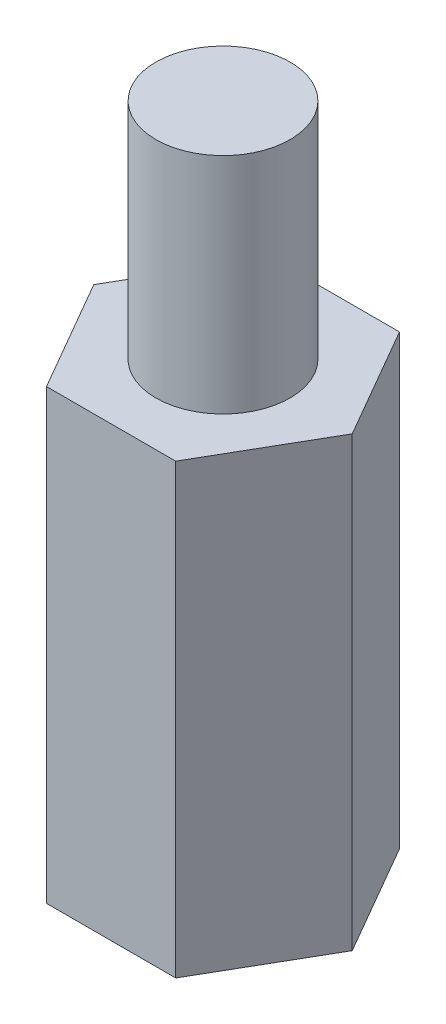
ISO-10303-21;
HEADER;
FILE_DESCRIPTION(('STEP AP214'),'2;1');
FILE_NAME('part.step','',(''),(''),'','','');
FILE_SCHEMA(('AUTOMOTIVE_DESIGN { 1 0 10303 214 1 1 1 1 }'));
ENDSEC;
DATA;
#1=APPLICATION_CONTEXT('core data for automotive mechanical design processes');
#2=APPLICATION_PROTOCOL_DEFINITION('international standard','automotive_design',2000,#1);
#3=PRODUCT_CONTEXT('',#1,'mechanical');
#4=PRODUCT('Part','Part','',(#3));
#5=PRODUCT_RELATED_PRODUCT_CATEGORY('part','',(#4));
#6=PRODUCT_DEFINITION_FORMATION('','',#4);
#7=PRODUCT_DEFINITION_CONTEXT('part definition',#1,'design');
#8=PRODUCT_DEFINITION('design','',#6,#7);
#9=PRODUCT_DEFINITION_SHAPE('','',#8);
#10=(LENGTH_UNIT() NAMED_UNIT(*) SI_UNIT(.MILLI.,.METRE.));
#11=(NAMED_UNIT(*) PLANE_ANGLE_UNIT() SI_UNIT($,.RADIAN.));
#12=(NAMED_UNIT(*) SI_UNIT($,.STERADIAN.) SOLID_ANGLE_UNIT());
#13=UNCERTAINTY_MEASURE_WITH_UNIT(LENGTH_MEASURE(1.E-05),#10,'distance_accuracy_value','');
#14=(GEOMETRIC_REPRESENTATION_CONTEXT(3) GLOBAL_UNCERTAINTY_ASSIGNED_CONTEXT((#13)) GLOBAL_UNIT_ASSIGNED_CONTEXT((#10,
#11,#12)) REPRESENTATION_CONTEXT('',''));
#15=CARTESIAN_POINT('',(0.,0.,0.));
#16=DIRECTION('',(0.,0.,1.));
#17=DIRECTION('',(1.,0.,0.));
#18=AXIS2_PLACEMENT_3D('',#15,#16,#17);
#19=CARTESIAN_POINT('',(-2.88675134594813,10.,0.));
#20=DIRECTION('',(0.866025403784438,0.,-0.5));
#21=DIRECTION('',(-0.5,0.,-0.866025403784438));
#22=AXIS2_PLACEMENT_3D('',#19,#20,#21);
#23=PLANE('',#22);
#24=DIRECTION('',(0.5,0.,0.866025403784438));
#25=VECTOR('',#24,1.);
#26=CARTESIAN_POINT('',(-2.88675134594813,0.,0.));
#27=LINE('',#26,#25);
#28=CARTESIAN_POINT('',(-2.88675134594813,0.,0.));
#29=VERTEX_POINT('',#28);
#30=CARTESIAN_POINT('',(-1.44337567297406,0.,2.5));
#31=VERTEX_POINT('',#30);
#32=EDGE_CURVE('E119',#29,#31,#27,.T.);
#33=ORIENTED_EDGE('',*,*,#32,.T.);
#34=DIRECTION('',(0.,-1.,0.));
#35=VECTOR('',#34,1.);
#36=CARTESIAN_POINT('',(-1.44337567297406,10.,2.5));
#37=LINE('',#36,#35);
#38=CARTESIAN_POINT('',(-1.44337567297406,10.,2.5));
#39=VERTEX_POINT('',#38);
#40=EDGE_CURVE('E36',#39,#31,#37,.T.);
#41=ORIENTED_EDGE('',*,*,#40,.F.);
#42=DIRECTION('',(0.5,0.,0.866025403784438));
#43=VECTOR('',#42,1.);
#44=CARTESIAN_POINT('',(-2.88675134594813,10.,0.));
#45=LINE('',#44,#43);
#46=CARTESIAN_POINT('',(-2.88675134594813,10.,0.));
#47=VERTEX_POINT('',#46);
#48=EDGE_CURVE('E130',#47,#39,#45,.T.);
#49=ORIENTED_EDGE('',*,*,#48,.F.);
#50=DIRECTION('',(0.,-1.,0.));
#51=VECTOR('',#50,1.);
#52=CARTESIAN_POINT('',(-2.88675134594813,10.,0.));
#53=LINE('',#52,#51);
#54=EDGE_CURVE('E115',#47,#29,#53,.T.);
#55=ORIENTED_EDGE('',*,*,#54,.T.);
#56=EDGE_LOOP('',(#33,#41,#49,#55));
#57=FACE_BOUND('',#56,.T.);
#58=ADVANCED_FACE('F33',(#57),#23,.F.);
#59=CARTESIAN_POINT('',(-1.44337567297406,10.,2.5));
#60=DIRECTION('',(0.,0.,-1.));
#61=DIRECTION('',(-1.,0.,0.));
#62=AXIS2_PLACEMENT_3D('',#59,#60,#61);
#63=PLANE('',#62);
#64=DIRECTION('',(1.,0.,0.));
#65=VECTOR('',#64,1.);
#66=CARTESIAN_POINT('',(-1.44337567297406,0.,2.5));
#67=LINE('',#66,#65);
#68=CARTESIAN_POINT('',(1.44337567297407,0.,2.5));
#69=VERTEX_POINT('',#68);
#70=EDGE_CURVE('E122',#31,#69,#67,.T.);
#71=ORIENTED_EDGE('',*,*,#70,.T.);
#72=DIRECTION('',(0.,-1.,0.));
#73=VECTOR('',#72,1.);
#74=CARTESIAN_POINT('',(1.44337567297407,10.,2.5));
#75=LINE('',#74,#73);
#76=CARTESIAN_POINT('',(1.44337567297407,10.,2.5));
#77=VERTEX_POINT('',#76);
#78=EDGE_CURVE('E133',#77,#69,#75,.T.);
#79=ORIENTED_EDGE('',*,*,#78,.F.);
#80=DIRECTION('',(1.,0.,0.));
#81=VECTOR('',#80,1.);
#82=CARTESIAN_POINT('',(-1.44337567297406,10.,2.5));
#83=LINE('',#82,#81);
#84=EDGE_CURVE('E88',#39,#77,#83,.T.);
#85=ORIENTED_EDGE('',*,*,#84,.F.);
#86=ORIENTED_EDGE('',*,*,#40,.T.);
#87=EDGE_LOOP('',(#71,#79,#85,#86));
#88=FACE_BOUND('',#87,.T.);
#89=ADVANCED_FACE('F138',(#88),#63,.F.);
#90=CARTESIAN_POINT('',(1.44337567297407,10.,2.5));
#91=DIRECTION('',(-0.866025403784439,0.,-0.5));
#92=DIRECTION('',(-0.5,0.,0.866025403784439));
#93=AXIS2_PLACEMENT_3D('',#90,#91,#92);
#94=PLANE('',#93);
#95=DIRECTION('',(0.5,0.,-0.866025403784439));
#96=VECTOR('',#95,1.);
#97=CARTESIAN_POINT('',(1.44337567297407,0.,2.5));
#98=LINE('',#97,#96);
#99=CARTESIAN_POINT('',(2.88675134594813,0.,0.));
#100=VERTEX_POINT('',#99);
#101=EDGE_CURVE('E125',#69,#100,#98,.T.);
#102=ORIENTED_EDGE('',*,*,#101,.T.);
#103=DIRECTION('',(0.,-1.,0.));
#104=VECTOR('',#103,1.);
#105=CARTESIAN_POINT('',(2.88675134594813,10.,0.));
#106=LINE('',#105,#104);
#107=CARTESIAN_POINT('',(2.88675134594813,10.,0.));
#108=VERTEX_POINT('',#107);
#109=EDGE_CURVE('E110',#108,#100,#106,.T.);
#110=ORIENTED_EDGE('',*,*,#109,.F.);
#111=DIRECTION('',(0.5,0.,-0.866025403784439));
#112=VECTOR('',#111,1.);
#113=CARTESIAN_POINT('',(1.44337567297407,10.,2.5));
#114=LINE('',#113,#112);
#115=EDGE_CURVE('E101',#77,#108,#114,.T.);
#116=ORIENTED_EDGE('',*,*,#115,.F.);
#117=ORIENTED_EDGE('',*,*,#78,.T.);
#118=EDGE_LOOP('',(#102,#110,#116,#117));
#119=FACE_BOUND('',#118,.T.);
#120=ADVANCED_FACE('F144',(#119),#94,.F.);
#121=CARTESIAN_POINT('',(2.88675134594813,10.,0.));
#122=DIRECTION('',(-0.866025403784438,0.,0.5));
#123=DIRECTION('',(0.5,0.,0.866025403784438));
#124=AXIS2_PLACEMENT_3D('',#121,#122,#123);
#125=PLANE('',#124);
#126=DIRECTION('',(-0.5,0.,-0.866025403784438));
#127=VECTOR('',#126,1.);
#128=CARTESIAN_POINT('',(2.88675134594813,0.,0.));
#129=LINE('',#128,#127);
#130=CARTESIAN_POINT('',(1.44337567297406,0.,-2.5));
#131=VERTEX_POINT('',#130);
#132=EDGE_CURVE('E109',#100,#131,#129,.T.);
#133=ORIENTED_EDGE('',*,*,#132,.T.);
#134=DIRECTION('',(0.,-1.,0.));
#135=VECTOR('',#134,1.);
#136=CARTESIAN_POINT('',(1.44337567297406,10.,-2.5));
#137=LINE('',#136,#135);
#138=CARTESIAN_POINT('',(1.44337567297406,10.,-2.5));
#139=VERTEX_POINT('',#138);
#140=EDGE_CURVE('E106',#139,#131,#137,.T.);
#141=ORIENTED_EDGE('',*,*,#140,.F.);
#142=DIRECTION('',(-0.5,0.,-0.866025403784438));
#143=VECTOR('',#142,1.);
#144=CARTESIAN_POINT('',(2.88675134594813,10.,0.));
#145=LINE('',#144,#143);
#146=EDGE_CURVE('E95',#108,#139,#145,.T.);
#147=ORIENTED_EDGE('',*,*,#146,.F.);
#148=ORIENTED_EDGE('',*,*,#109,.T.);
#149=EDGE_LOOP('',(#133,#141,#147,#148));
#150=FACE_BOUND('',#149,.T.);
#151=ADVANCED_FACE('F107',(#150),#125,.F.);
#152=CARTESIAN_POINT('',(1.44337567297406,10.,-2.5));
#153=DIRECTION('',(0.,0.,1.));
#154=DIRECTION('',(1.,0.,0.));
#155=AXIS2_PLACEMENT_3D('',#152,#153,#154);
#156=PLANE('',#155);
#157=DIRECTION('',(-1.,0.,0.));
#158=VECTOR('',#157,1.);
#159=CARTESIAN_POINT('',(1.44337567297406,0.,-2.5));
#160=LINE('',#159,#158);
#161=CARTESIAN_POINT('',(-1.44337567297406,0.,-2.5));
#162=VERTEX_POINT('',#161);
#163=EDGE_CURVE('E73',#131,#162,#160,.T.);
#164=ORIENTED_EDGE('',*,*,#163,.T.);
#165=DIRECTION('',(0.,-1.,0.));
#166=VECTOR('',#165,1.);
#167=CARTESIAN_POINT('',(-1.44337567297406,10.,-2.5));
#168=LINE('',#167,#166);
#169=CARTESIAN_POINT('',(-1.44337567297406,10.,-2.5));
#170=VERTEX_POINT('',#169);
#171=EDGE_CURVE('E111',#170,#162,#168,.T.);
#172=ORIENTED_EDGE('',*,*,#171,.F.);
#173=DIRECTION('',(-1.,0.,0.));
#174=VECTOR('',#173,1.);
#175=CARTESIAN_POINT('',(1.44337567297406,10.,-2.5));
#176=LINE('',#175,#174);
#177=EDGE_CURVE('E99',#139,#170,#176,.T.);
#178=ORIENTED_EDGE('',*,*,#177,.F.);
#179=ORIENTED_EDGE('',*,*,#140,.T.);
#180=EDGE_LOOP('',(#164,#172,#178,#179));
#181=FACE_BOUND('',#180,.T.);
#182=ADVANCED_FACE('F113',(#181),#156,.F.);
#183=CARTESIAN_POINT('',(-1.44337567297406,10.,-2.5));
#184=DIRECTION('',(0.866025403784439,0.,0.5));
#185=DIRECTION('',(0.5,0.,-0.866025403784439));
#186=AXIS2_PLACEMENT_3D('',#183,#184,#185);
#187=PLANE('',#186);
#188=DIRECTION('',(-0.5,0.,0.866025403784439));
#189=VECTOR('',#188,1.);
#190=CARTESIAN_POINT('',(-1.44337567297406,0.,-2.5));
#191=LINE('',#190,#189);
#192=EDGE_CURVE('E79',#162,#29,#191,.T.);
#193=ORIENTED_EDGE('',*,*,#192,.T.);
#194=ORIENTED_EDGE('',*,*,#54,.F.);
#195=DIRECTION('',(-0.5,0.,0.866025403784439));
#196=VECTOR('',#195,1.);
#197=CARTESIAN_POINT('',(-1.44337567297406,10.,-2.5));
#198=LINE('',#197,#196);
#199=EDGE_CURVE('E50',#170,#47,#198,.T.);
#200=ORIENTED_EDGE('',*,*,#199,.F.);
#201=ORIENTED_EDGE('',*,*,#171,.T.);
#202=EDGE_LOOP('',(#193,#194,#200,#201));
#203=FACE_BOUND('',#202,.T.);
#204=ADVANCED_FACE('F175',(#203),#187,.F.);
#205=CARTESIAN_POINT('',(0.,10.,0.));
#206=DIRECTION('',(0.,1.,0.));
#207=DIRECTION('',(0.,0.,1.));
#208=AXIS2_PLACEMENT_3D('',#205,#206,#207);
#209=PLANE('',#208);
#210=CARTESIAN_POINT('',(0.,10.,0.));
#211=DIRECTION('',(0.,1.,0.));
#212=DIRECTION('',(0.,0.,1.));
#213=AXIS2_PLACEMENT_3D('',#210,#211,#212);
#214=CIRCLE('',#213,1.5);
#215=CARTESIAN_POINT('',(0.,10.,1.5));
#216=VERTEX_POINT('',#215);
#217=EDGE_CURVE('E11',#216,#216,#214,.T.);
#218=ORIENTED_EDGE('',*,*,#217,.F.);
#219=EDGE_LOOP('',(#218));
#220=FACE_BOUND('',#219,.T.);
#221=ORIENTED_EDGE('',*,*,#48,.T.);
#222=ORIENTED_EDGE('',*,*,#84,.T.);
#223=ORIENTED_EDGE('',*,*,#115,.T.);
#224=ORIENTED_EDGE('',*,*,#146,.T.);
#225=ORIENTED_EDGE('',*,*,#177,.T.);
#226=ORIENTED_EDGE('',*,*,#199,.T.);
#227=EDGE_LOOP('',(#221,#222,#223,#224,#225,#226));
#228=FACE_BOUND('',#227,.T.);
#229=ADVANCED_FACE('F97',(#220,#228),#209,.T.);
#230=CARTESIAN_POINT('',(0.,0.,0.));
#231=DIRECTION('',(0.,1.,0.));
#232=DIRECTION('',(0.,0.,1.));
#233=AXIS2_PLACEMENT_3D('',#230,#231,#232);
#234=PLANE('',#233);
#235=CARTESIAN_POINT('',(0.,0.,0.));
#236=DIRECTION('',(0.,-1.,0.));
#237=DIRECTION('',(0.,0.,-1.));
#238=AXIS2_PLACEMENT_3D('',#235,#236,#237);
#239=CIRCLE('',#238,1.5);
#240=CARTESIAN_POINT('',(0.,0.,-1.5));
#241=VERTEX_POINT('',#240);
#242=EDGE_CURVE('E151',#241,#241,#239,.T.);
#243=ORIENTED_EDGE('',*,*,#242,.F.);
#244=EDGE_LOOP('',(#243));
#245=FACE_BOUND('',#244,.T.);
#246=ORIENTED_EDGE('',*,*,#32,.F.);
#247=ORIENTED_EDGE('',*,*,#192,.F.);
#248=ORIENTED_EDGE('',*,*,#163,.F.);
#249=ORIENTED_EDGE('',*,*,#132,.F.);
#250=ORIENTED_EDGE('',*,*,#101,.F.);
#251=ORIENTED_EDGE('',*,*,#70,.F.);
#252=EDGE_LOOP('',(#246,#247,#248,#249,#250,#251));
#253=FACE_BOUND('',#252,.T.);
#254=ADVANCED_FACE('F143',(#245,#253),#234,.F.);
#255=CARTESIAN_POINT('',(0.,15.,0.));
#256=DIRECTION('',(0.,-1.,0.));
#257=DIRECTION('',(0.,0.,-1.));
#258=AXIS2_PLACEMENT_3D('',#255,#256,#257);
#259=CYLINDRICAL_SURFACE('',#258,1.5);
#260=CARTESIAN_POINT('',(0.,15.,0.));
#261=DIRECTION('',(0.,1.,0.));
#262=DIRECTION('',(0.,0.,1.));
#263=AXIS2_PLACEMENT_3D('',#260,#261,#262);
#264=CIRCLE('',#263,1.5);
#265=CARTESIAN_POINT('',(0.,15.,1.5));
#266=VERTEX_POINT('',#265);
#267=EDGE_CURVE('E123',#266,#266,#264,.T.);
#268=ORIENTED_EDGE('',*,*,#267,.F.);
#269=EDGE_LOOP('',(#268));
#270=FACE_BOUND('',#269,.T.);
#271=ORIENTED_EDGE('',*,*,#217,.T.);
#272=EDGE_LOOP('',(#271));
#273=FACE_BOUND('',#272,.T.);
#274=ADVANCED_FACE('F167',(#270,#273),#259,.T.);
#275=CARTESIAN_POINT('',(0.,15.,0.));
#276=DIRECTION('',(0.,1.,0.));
#277=DIRECTION('',(0.,0.,1.));
#278=AXIS2_PLACEMENT_3D('',#275,#276,#277);
#279=PLANE('',#278);
#280=ORIENTED_EDGE('',*,*,#267,.T.);
#281=EDGE_LOOP('',(#280));
#282=FACE_BOUND('',#281,.T.);
#283=ADVANCED_FACE('F162',(#282),#279,.T.);
#284=CARTESIAN_POINT('',(0.,6.,0.));
#285=DIRECTION('',(0.,-1.,0.));
#286=DIRECTION('',(0.,0.,-1.));
#287=AXIS2_PLACEMENT_3D('',#284,#285,#286);
#288=CYLINDRICAL_SURFACE('',#287,1.5);
#289=CARTESIAN_POINT('',(0.,6.,0.));
#290=DIRECTION('',(0.,-1.,0.));
#291=DIRECTION('',(0.,0.,-1.));
#292=AXIS2_PLACEMENT_3D('',#289,#290,#291);
#293=CIRCLE('',#292,1.5);
#294=CARTESIAN_POINT('',(0.,6.,-1.5));
#295=VERTEX_POINT('',#294);
#296=EDGE_CURVE('E150',#295,#295,#293,.T.);
#297=ORIENTED_EDGE('',*,*,#296,.F.);
#298=EDGE_LOOP('',(#297));
#299=FACE_BOUND('',#298,.T.);
#300=ORIENTED_EDGE('',*,*,#242,.T.);
#301=EDGE_LOOP('',(#300));
#302=FACE_BOUND('',#301,.T.);
#303=ADVANCED_FACE('F159',(#299,#302),#288,.F.);
#304=CARTESIAN_POINT('',(0.,6.,0.));
#305=DIRECTION('',(0.,-1.,0.));
#306=DIRECTION('',(0.,0.,-1.));
#307=AXIS2_PLACEMENT_3D('',#304,#305,#306);
#308=PLANE('',#307);
#309=ORIENTED_EDGE('',*,*,#296,.T.);
#310=EDGE_LOOP('',(#309));
#311=FACE_BOUND('',#310,.T.);
#312=ADVANCED_FACE('F157',(#311),#308,.T.);
#313=CLOSED_SHELL('',(#58,#89,#120,#151,#182,#204,#229,#254,#274,#283,#303,#312));
#314=MANIFOLD_SOLID_BREP('B2',#313);
#315=ADVANCED_BREP_SHAPE_REPRESENTATION('',(#18,#314),#14);
#316=SHAPE_DEFINITION_REPRESENTATION(#9,#315);
ENDSEC;
END-ISO-10303-21;
